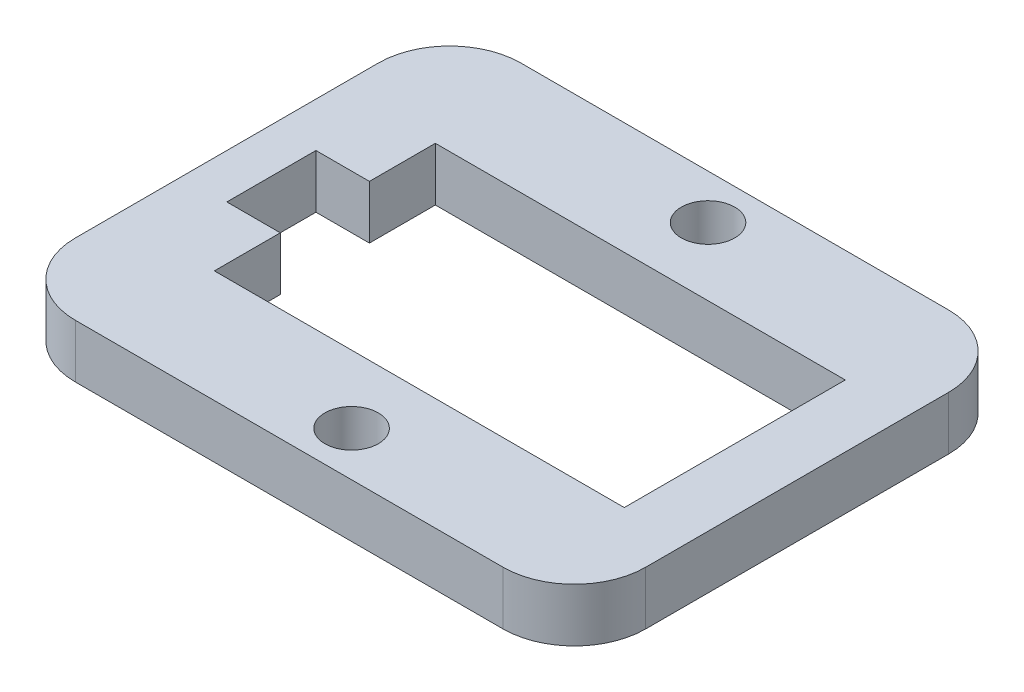
ISO-10303-21;
HEADER;
FILE_DESCRIPTION(('STEP AP214'),'2;1');
FILE_NAME('part.step','',(''),(''),'','','');
FILE_SCHEMA(('AUTOMOTIVE_DESIGN { 1 0 10303 214 1 1 1 1 }'));
ENDSEC;
DATA;
#1=APPLICATION_CONTEXT('core data for automotive mechanical design processes');
#2=APPLICATION_PROTOCOL_DEFINITION('international standard','automotive_design',2000,#1);
#3=PRODUCT_CONTEXT('',#1,'mechanical');
#4=PRODUCT('Part','Part','',(#3));
#5=PRODUCT_RELATED_PRODUCT_CATEGORY('part','',(#4));
#6=PRODUCT_DEFINITION_FORMATION('','',#4);
#7=PRODUCT_DEFINITION_CONTEXT('part definition',#1,'design');
#8=PRODUCT_DEFINITION('design','',#6,#7);
#9=PRODUCT_DEFINITION_SHAPE('','',#8);
#10=(LENGTH_UNIT() NAMED_UNIT(*) SI_UNIT(.MILLI.,.METRE.));
#11=(NAMED_UNIT(*) PLANE_ANGLE_UNIT() SI_UNIT($,.RADIAN.));
#12=(NAMED_UNIT(*) SI_UNIT($,.STERADIAN.) SOLID_ANGLE_UNIT());
#13=UNCERTAINTY_MEASURE_WITH_UNIT(LENGTH_MEASURE(1.E-05),#10,'distance_accuracy_value','');
#14=(GEOMETRIC_REPRESENTATION_CONTEXT(3) GLOBAL_UNCERTAINTY_ASSIGNED_CONTEXT((#13)) GLOBAL_UNIT_ASSIGNED_CONTEXT((#10,
#11,#12)) REPRESENTATION_CONTEXT('',''));
#15=CARTESIAN_POINT('',(0.,0.,0.));
#16=DIRECTION('',(0.,0.,1.));
#17=DIRECTION('',(1.,0.,0.));
#18=AXIS2_PLACEMENT_3D('',#15,#16,#17);
#19=CARTESIAN_POINT('',(-10.5,0.,6.20000000000001));
#20=DIRECTION('',(-1.,0.,0.));
#21=DIRECTION('',(0.,0.,1.));
#22=AXIS2_PLACEMENT_3D('',#19,#20,#21);
#23=PLANE('',#22);
#24=DIRECTION('',(0.,0.,1.));
#25=VECTOR('',#24,1.);
#26=CARTESIAN_POINT('',(-10.5,0.,6.20000000000001));
#27=LINE('',#26,#25);
#28=CARTESIAN_POINT('',(-10.5,0.,2.50000000000001));
#29=VERTEX_POINT('',#28);
#30=CARTESIAN_POINT('',(-10.5,0.,6.20000000000001));
#31=VERTEX_POINT('',#30);
#32=EDGE_CURVE('E208',#29,#31,#27,.T.);
#33=ORIENTED_EDGE('',*,*,#32,.F.);
#34=DIRECTION('',(0.,1.,0.));
#35=VECTOR('',#34,1.);
#36=CARTESIAN_POINT('',(-10.5,0.,2.50000000000001));
#37=LINE('',#36,#35);
#38=CARTESIAN_POINT('',(-10.5,3.,2.50000000000001));
#39=VERTEX_POINT('',#38);
#40=EDGE_CURVE('E184',#29,#39,#37,.T.);
#41=ORIENTED_EDGE('',*,*,#40,.T.);
#42=DIRECTION('',(0.,0.,1.));
#43=VECTOR('',#42,1.);
#44=CARTESIAN_POINT('',(-10.5,3.,6.20000000000001));
#45=LINE('',#44,#43);
#46=CARTESIAN_POINT('',(-10.5,3.,6.20000000000001));
#47=VERTEX_POINT('',#46);
#48=EDGE_CURVE('E218',#39,#47,#45,.T.);
#49=ORIENTED_EDGE('',*,*,#48,.T.);
#50=DIRECTION('',(0.,1.,0.));
#51=VECTOR('',#50,1.);
#52=CARTESIAN_POINT('',(-10.5,0.,6.20000000000001));
#53=LINE('',#52,#51);
#54=EDGE_CURVE('E227',#31,#47,#53,.T.);
#55=ORIENTED_EDGE('',*,*,#54,.F.);
#56=EDGE_LOOP('',(#33,#41,#49,#55));
#57=FACE_BOUND('',#56,.T.);
#58=ADVANCED_FACE('F36',(#57),#23,.F.);
#59=CARTESIAN_POINT('',(0.,0.,0.));
#60=DIRECTION('',(0.,-1.,0.));
#61=DIRECTION('',(0.,0.,-1.));
#62=AXIS2_PLACEMENT_3D('',#59,#60,#61);
#63=PLANE('',#62);
#64=DIRECTION('',(1.,0.,0.));
#65=VECTOR('',#64,1.);
#66=CARTESIAN_POINT('',(-13.5,0.,2.50000000000001));
#67=LINE('',#66,#65);
#68=CARTESIAN_POINT('',(-13.5,0.,2.50000000000001));
#69=VERTEX_POINT('',#68);
#70=EDGE_CURVE('E169',#69,#29,#67,.T.);
#71=ORIENTED_EDGE('',*,*,#70,.T.);
#72=ORIENTED_EDGE('',*,*,#32,.T.);
#73=DIRECTION('',(1.,0.,0.));
#74=VECTOR('',#73,1.);
#75=CARTESIAN_POINT('',(-10.5,0.,6.20000000000001));
#76=LINE('',#75,#74);
#77=CARTESIAN_POINT('',(12.5,0.,6.2));
#78=VERTEX_POINT('',#77);
#79=EDGE_CURVE('E210',#31,#78,#76,.T.);
#80=ORIENTED_EDGE('',*,*,#79,.T.);
#81=DIRECTION('',(0.,0.,-1.));
#82=VECTOR('',#81,1.);
#83=CARTESIAN_POINT('',(12.5,0.,6.2));
#84=LINE('',#83,#82);
#85=CARTESIAN_POINT('',(12.5,0.,-6.2));
#86=VERTEX_POINT('',#85);
#87=EDGE_CURVE('E202',#78,#86,#84,.T.);
#88=ORIENTED_EDGE('',*,*,#87,.T.);
#89=DIRECTION('',(-1.,0.,0.));
#90=VECTOR('',#89,1.);
#91=CARTESIAN_POINT('',(-10.5,0.,-6.19999999999998));
#92=LINE('',#91,#90);
#93=CARTESIAN_POINT('',(-10.5,0.,-6.19999999999998));
#94=VERTEX_POINT('',#93);
#95=EDGE_CURVE('E205',#86,#94,#92,.T.);
#96=ORIENTED_EDGE('',*,*,#95,.T.);
#97=CARTESIAN_POINT('',(-10.5,0.,-2.5));
#98=VERTEX_POINT('',#97);
#99=EDGE_CURVE('E175',#94,#98,#27,.T.);
#100=ORIENTED_EDGE('',*,*,#99,.T.);
#101=DIRECTION('',(-1.,0.,0.));
#102=VECTOR('',#101,1.);
#103=CARTESIAN_POINT('',(-13.5,0.,-2.5));
#104=LINE('',#103,#102);
#105=CARTESIAN_POINT('',(-13.5,0.,-2.5));
#106=VERTEX_POINT('',#105);
#107=EDGE_CURVE('E153',#98,#106,#104,.T.);
#108=ORIENTED_EDGE('',*,*,#107,.T.);
#109=DIRECTION('',(0.,0.,1.));
#110=VECTOR('',#109,1.);
#111=CARTESIAN_POINT('',(-13.5,0.,-2.5));
#112=LINE('',#111,#110);
#113=EDGE_CURVE('E164',#106,#69,#112,.T.);
#114=ORIENTED_EDGE('',*,*,#113,.T.);
#115=EDGE_LOOP('',(#71,#72,#80,#88,#96,#100,#108,#114));
#116=FACE_BOUND('',#115,.T.);
#117=CARTESIAN_POINT('',(1.00000000000001,0.,-10.));
#118=DIRECTION('',(0.,1.,0.));
#119=DIRECTION('',(0.,0.,1.));
#120=AXIS2_PLACEMENT_3D('',#117,#118,#119);
#121=CIRCLE('',#120,1.5);
#122=CARTESIAN_POINT('',(1.00000000000001,0.,-8.5));
#123=VERTEX_POINT('',#122);
#124=EDGE_CURVE('E192',#123,#123,#121,.T.);
#125=ORIENTED_EDGE('',*,*,#124,.T.);
#126=EDGE_LOOP('',(#125));
#127=FACE_BOUND('',#126,.T.);
#128=DIRECTION('',(1.,0.,0.));
#129=VECTOR('',#128,1.);
#130=CARTESIAN_POINT('',(-16.,0.,12.5));
#131=LINE('',#130,#129);
#132=CARTESIAN_POINT('',(-12.,0.,12.5));
#133=VERTEX_POINT('',#132);
#134=CARTESIAN_POINT('',(12.,0.,12.5));
#135=VERTEX_POINT('',#134);
#136=EDGE_CURVE('E237',#133,#135,#131,.T.);
#137=ORIENTED_EDGE('',*,*,#136,.F.);
#138=CARTESIAN_POINT('',(-12.,0.,8.5));
#139=DIRECTION('',(0.,-1.,0.));
#140=DIRECTION('',(0.,0.,-1.));
#141=AXIS2_PLACEMENT_3D('',#138,#139,#140);
#142=CIRCLE('',#141,4.);
#143=CARTESIAN_POINT('',(-16.,0.,8.5));
#144=VERTEX_POINT('',#143);
#145=EDGE_CURVE('E265',#133,#144,#142,.T.);
#146=ORIENTED_EDGE('',*,*,#145,.T.);
#147=DIRECTION('',(0.,0.,1.));
#148=VECTOR('',#147,1.);
#149=CARTESIAN_POINT('',(-16.,0.,12.5));
#150=LINE('',#149,#148);
#151=CARTESIAN_POINT('',(-16.,0.,-8.5));
#152=VERTEX_POINT('',#151);
#153=EDGE_CURVE('E250',#152,#144,#150,.T.);
#154=ORIENTED_EDGE('',*,*,#153,.F.);
#155=CARTESIAN_POINT('',(-12.,0.,-8.5));
#156=DIRECTION('',(0.,-1.,0.));
#157=DIRECTION('',(0.,0.,-1.));
#158=AXIS2_PLACEMENT_3D('',#155,#156,#157);
#159=CIRCLE('',#158,4.);
#160=CARTESIAN_POINT('',(-12.,0.,-12.5));
#161=VERTEX_POINT('',#160);
#162=EDGE_CURVE('E263',#152,#161,#159,.T.);
#163=ORIENTED_EDGE('',*,*,#162,.T.);
#164=DIRECTION('',(-1.,0.,0.));
#165=VECTOR('',#164,1.);
#166=CARTESIAN_POINT('',(-16.,0.,-12.5));
#167=LINE('',#166,#165);
#168=CARTESIAN_POINT('',(12.,0.,-12.5));
#169=VERTEX_POINT('',#168);
#170=EDGE_CURVE('E248',#169,#161,#167,.T.);
#171=ORIENTED_EDGE('',*,*,#170,.F.);
#172=CARTESIAN_POINT('',(12.,0.,-8.5));
#173=DIRECTION('',(0.,-1.,0.));
#174=DIRECTION('',(0.,0.,-1.));
#175=AXIS2_PLACEMENT_3D('',#172,#173,#174);
#176=CIRCLE('',#175,4.);
#177=CARTESIAN_POINT('',(16.,0.,-8.5));
#178=VERTEX_POINT('',#177);
#179=EDGE_CURVE('E261',#169,#178,#176,.T.);
#180=ORIENTED_EDGE('',*,*,#179,.T.);
#181=DIRECTION('',(0.,0.,-1.));
#182=VECTOR('',#181,1.);
#183=CARTESIAN_POINT('',(16.,0.,12.5));
#184=LINE('',#183,#182);
#185=CARTESIAN_POINT('',(16.,0.,8.5));
#186=VERTEX_POINT('',#185);
#187=EDGE_CURVE('E226',#186,#178,#184,.T.);
#188=ORIENTED_EDGE('',*,*,#187,.F.);
#189=CARTESIAN_POINT('',(12.,0.,8.5));
#190=DIRECTION('',(0.,-1.,0.));
#191=DIRECTION('',(0.,0.,-1.));
#192=AXIS2_PLACEMENT_3D('',#189,#190,#191);
#193=CIRCLE('',#192,4.);
#194=EDGE_CURVE('E259',#186,#135,#193,.T.);
#195=ORIENTED_EDGE('',*,*,#194,.T.);
#196=EDGE_LOOP('',(#137,#146,#154,#163,#171,#180,#188,#195));
#197=FACE_BOUND('',#196,.T.);
#198=CARTESIAN_POINT('',(1.00000000000001,0.,10.));
#199=DIRECTION('',(0.,1.,0.));
#200=DIRECTION('',(0.,0.,1.));
#201=AXIS2_PLACEMENT_3D('',#198,#199,#200);
#202=CIRCLE('',#201,1.5);
#203=CARTESIAN_POINT('',(1.00000000000001,0.,11.5));
#204=VERTEX_POINT('',#203);
#205=EDGE_CURVE('E198',#204,#204,#202,.T.);
#206=ORIENTED_EDGE('',*,*,#205,.T.);
#207=EDGE_LOOP('',(#206));
#208=FACE_BOUND('',#207,.T.);
#209=ADVANCED_FACE('F172',(#116,#127,#197,#208),#63,.T.);
#210=CARTESIAN_POINT('',(16.,3.,12.5));
#211=DIRECTION('',(-1.,0.,0.));
#212=DIRECTION('',(0.,0.,1.));
#213=AXIS2_PLACEMENT_3D('',#210,#211,#212);
#214=PLANE('',#213);
#215=ORIENTED_EDGE('',*,*,#187,.T.);
#216=DIRECTION('',(0.,-1.,0.));
#217=VECTOR('',#216,1.);
#218=CARTESIAN_POINT('',(16.,3.,-8.5));
#219=LINE('',#218,#217);
#220=CARTESIAN_POINT('',(16.,3.,-8.5));
#221=VERTEX_POINT('',#220);
#222=EDGE_CURVE('E11',#178,#221,#219,.F.);
#223=ORIENTED_EDGE('',*,*,#222,.T.);
#224=DIRECTION('',(0.,0.,-1.));
#225=VECTOR('',#224,1.);
#226=CARTESIAN_POINT('',(16.,3.,12.5));
#227=LINE('',#226,#225);
#228=CARTESIAN_POINT('',(16.,3.,8.5));
#229=VERTEX_POINT('',#228);
#230=EDGE_CURVE('E234',#229,#221,#227,.T.);
#231=ORIENTED_EDGE('',*,*,#230,.F.);
#232=DIRECTION('',(0.,-1.,0.));
#233=VECTOR('',#232,1.);
#234=CARTESIAN_POINT('',(16.,3.,8.5));
#235=LINE('',#234,#233);
#236=EDGE_CURVE('E44',#229,#186,#235,.T.);
#237=ORIENTED_EDGE('',*,*,#236,.T.);
#238=EDGE_LOOP('',(#215,#223,#231,#237));
#239=FACE_BOUND('',#238,.T.);
#240=ADVANCED_FACE('F287',(#239),#214,.F.);
#241=CARTESIAN_POINT('',(-16.,3.,-12.5));
#242=DIRECTION('',(0.,0.,1.));
#243=DIRECTION('',(1.,0.,0.));
#244=AXIS2_PLACEMENT_3D('',#241,#242,#243);
#245=PLANE('',#244);
#246=ORIENTED_EDGE('',*,*,#170,.T.);
#247=DIRECTION('',(0.,-1.,0.));
#248=VECTOR('',#247,1.);
#249=CARTESIAN_POINT('',(-12.,3.,-12.5));
#250=LINE('',#249,#248);
#251=CARTESIAN_POINT('',(-12.,3.,-12.5));
#252=VERTEX_POINT('',#251);
#253=EDGE_CURVE('E51',#161,#252,#250,.F.);
#254=ORIENTED_EDGE('',*,*,#253,.T.);
#255=DIRECTION('',(-1.,0.,0.));
#256=VECTOR('',#255,1.);
#257=CARTESIAN_POINT('',(-16.,3.,-12.5));
#258=LINE('',#257,#256);
#259=CARTESIAN_POINT('',(12.,3.,-12.5));
#260=VERTEX_POINT('',#259);
#261=EDGE_CURVE('E236',#260,#252,#258,.T.);
#262=ORIENTED_EDGE('',*,*,#261,.F.);
#263=DIRECTION('',(0.,-1.,0.));
#264=VECTOR('',#263,1.);
#265=CARTESIAN_POINT('',(12.,3.,-12.5));
#266=LINE('',#265,#264);
#267=EDGE_CURVE('E279',#260,#169,#266,.T.);
#268=ORIENTED_EDGE('',*,*,#267,.T.);
#269=EDGE_LOOP('',(#246,#254,#262,#268));
#270=FACE_BOUND('',#269,.T.);
#271=ADVANCED_FACE('F298',(#270),#245,.F.);
#272=CARTESIAN_POINT('',(-16.,3.,12.5));
#273=DIRECTION('',(1.,0.,0.));
#274=DIRECTION('',(0.,0.,-1.));
#275=AXIS2_PLACEMENT_3D('',#272,#273,#274);
#276=PLANE('',#275);
#277=ORIENTED_EDGE('',*,*,#153,.T.);
#278=DIRECTION('',(0.,-1.,0.));
#279=VECTOR('',#278,1.);
#280=CARTESIAN_POINT('',(-16.,3.,8.5));
#281=LINE('',#280,#279);
#282=CARTESIAN_POINT('',(-16.,3.,8.5));
#283=VERTEX_POINT('',#282);
#284=EDGE_CURVE('E270',#144,#283,#281,.F.);
#285=ORIENTED_EDGE('',*,*,#284,.T.);
#286=DIRECTION('',(0.,0.,1.));
#287=VECTOR('',#286,1.);
#288=CARTESIAN_POINT('',(-16.,3.,12.5));
#289=LINE('',#288,#287);
#290=CARTESIAN_POINT('',(-16.,3.,-8.5));
#291=VERTEX_POINT('',#290);
#292=EDGE_CURVE('E239',#291,#283,#289,.T.);
#293=ORIENTED_EDGE('',*,*,#292,.F.);
#294=DIRECTION('',(0.,-1.,0.));
#295=VECTOR('',#294,1.);
#296=CARTESIAN_POINT('',(-16.,3.,-8.5));
#297=LINE('',#296,#295);
#298=EDGE_CURVE('E267',#291,#152,#297,.T.);
#299=ORIENTED_EDGE('',*,*,#298,.T.);
#300=EDGE_LOOP('',(#277,#285,#293,#299));
#301=FACE_BOUND('',#300,.T.);
#302=ADVANCED_FACE('F307',(#301),#276,.F.);
#303=CARTESIAN_POINT('',(-16.,3.,12.5));
#304=DIRECTION('',(0.,0.,-1.));
#305=DIRECTION('',(-1.,0.,0.));
#306=AXIS2_PLACEMENT_3D('',#303,#304,#305);
#307=PLANE('',#306);
#308=DIRECTION('',(1.,0.,0.));
#309=VECTOR('',#308,1.);
#310=CARTESIAN_POINT('',(-16.,3.,12.5));
#311=LINE('',#310,#309);
#312=CARTESIAN_POINT('',(-12.,3.,12.5));
#313=VERTEX_POINT('',#312);
#314=CARTESIAN_POINT('',(12.,3.,12.5));
#315=VERTEX_POINT('',#314);
#316=EDGE_CURVE('E242',#313,#315,#311,.T.);
#317=ORIENTED_EDGE('',*,*,#316,.F.);
#318=DIRECTION('',(0.,-1.,0.));
#319=VECTOR('',#318,1.);
#320=CARTESIAN_POINT('',(-12.,3.,12.5));
#321=LINE('',#320,#319);
#322=EDGE_CURVE('E256',#313,#133,#321,.T.);
#323=ORIENTED_EDGE('',*,*,#322,.T.);
#324=ORIENTED_EDGE('',*,*,#136,.T.);
#325=DIRECTION('',(0.,-1.,0.));
#326=VECTOR('',#325,1.);
#327=CARTESIAN_POINT('',(12.,3.,12.5));
#328=LINE('',#327,#326);
#329=EDGE_CURVE('E245',#135,#315,#328,.F.);
#330=ORIENTED_EDGE('',*,*,#329,.T.);
#331=EDGE_LOOP('',(#317,#323,#324,#330));
#332=FACE_BOUND('',#331,.T.);
#333=ADVANCED_FACE('F315',(#332),#307,.F.);
#334=CARTESIAN_POINT('',(0.,3.,0.));
#335=DIRECTION('',(0.,-1.,0.));
#336=DIRECTION('',(0.,0.,-1.));
#337=AXIS2_PLACEMENT_3D('',#334,#335,#336);
#338=PLANE('',#337);
#339=CARTESIAN_POINT('',(1.00000000000001,3.,-10.));
#340=DIRECTION('',(0.,1.,0.));
#341=DIRECTION('',(0.,0.,1.));
#342=AXIS2_PLACEMENT_3D('',#339,#340,#341);
#343=CIRCLE('',#342,1.5);
#344=CARTESIAN_POINT('',(1.00000000000001,3.,-8.5));
#345=VERTEX_POINT('',#344);
#346=EDGE_CURVE('E187',#345,#345,#343,.T.);
#347=ORIENTED_EDGE('',*,*,#346,.F.);
#348=EDGE_LOOP('',(#347));
#349=FACE_BOUND('',#348,.T.);
#350=CARTESIAN_POINT('',(1.00000000000001,3.,10.));
#351=DIRECTION('',(0.,1.,0.));
#352=DIRECTION('',(0.,0.,1.));
#353=AXIS2_PLACEMENT_3D('',#350,#351,#352);
#354=CIRCLE('',#353,1.5);
#355=CARTESIAN_POINT('',(1.00000000000001,3.,11.5));
#356=VERTEX_POINT('',#355);
#357=EDGE_CURVE('E195',#356,#356,#354,.T.);
#358=ORIENTED_EDGE('',*,*,#357,.F.);
#359=EDGE_LOOP('',(#358));
#360=FACE_BOUND('',#359,.T.);
#361=ORIENTED_EDGE('',*,*,#48,.F.);
#362=DIRECTION('',(1.,0.,0.));
#363=VECTOR('',#362,1.);
#364=CARTESIAN_POINT('',(-13.5,3.,2.50000000000001));
#365=LINE('',#364,#363);
#366=CARTESIAN_POINT('',(-13.5,3.,2.50000000000001));
#367=VERTEX_POINT('',#366);
#368=EDGE_CURVE('E176',#367,#39,#365,.T.);
#369=ORIENTED_EDGE('',*,*,#368,.F.);
#370=DIRECTION('',(0.,0.,1.));
#371=VECTOR('',#370,1.);
#372=CARTESIAN_POINT('',(-13.5,3.,-2.5));
#373=LINE('',#372,#371);
#374=CARTESIAN_POINT('',(-13.5,3.,-2.5));
#375=VERTEX_POINT('',#374);
#376=EDGE_CURVE('E178',#375,#367,#373,.T.);
#377=ORIENTED_EDGE('',*,*,#376,.F.);
#378=DIRECTION('',(-1.,0.,0.));
#379=VECTOR('',#378,1.);
#380=CARTESIAN_POINT('',(-13.5,3.,-2.5));
#381=LINE('',#380,#379);
#382=CARTESIAN_POINT('',(-10.5,3.,-2.5));
#383=VERTEX_POINT('',#382);
#384=EDGE_CURVE('E156',#383,#375,#381,.T.);
#385=ORIENTED_EDGE('',*,*,#384,.F.);
#386=CARTESIAN_POINT('',(-10.5,3.,-6.19999999999998));
#387=VERTEX_POINT('',#386);
#388=EDGE_CURVE('E219',#387,#383,#45,.T.);
#389=ORIENTED_EDGE('',*,*,#388,.F.);
#390=DIRECTION('',(-1.,0.,0.));
#391=VECTOR('',#390,1.);
#392=CARTESIAN_POINT('',(-10.5,3.,-6.19999999999998));
#393=LINE('',#392,#391);
#394=CARTESIAN_POINT('',(12.5,3.,-6.2));
#395=VERTEX_POINT('',#394);
#396=EDGE_CURVE('E215',#395,#387,#393,.T.);
#397=ORIENTED_EDGE('',*,*,#396,.F.);
#398=DIRECTION('',(0.,0.,-1.));
#399=VECTOR('',#398,1.);
#400=CARTESIAN_POINT('',(12.5,3.,6.2));
#401=LINE('',#400,#399);
#402=CARTESIAN_POINT('',(12.5,3.,6.2));
#403=VERTEX_POINT('',#402);
#404=EDGE_CURVE('E201',#403,#395,#401,.T.);
#405=ORIENTED_EDGE('',*,*,#404,.F.);
#406=DIRECTION('',(1.,0.,0.));
#407=VECTOR('',#406,1.);
#408=CARTESIAN_POINT('',(-10.5,3.,6.20000000000001));
#409=LINE('',#408,#407);
#410=EDGE_CURVE('E206',#47,#403,#409,.T.);
#411=ORIENTED_EDGE('',*,*,#410,.F.);
#412=EDGE_LOOP('',(#361,#369,#377,#385,#389,#397,#405,#411));
#413=FACE_BOUND('',#412,.T.);
#414=ORIENTED_EDGE('',*,*,#292,.T.);
#415=CARTESIAN_POINT('',(-12.,3.,8.5));
#416=DIRECTION('',(0.,-1.,0.));
#417=DIRECTION('',(0.,0.,-1.));
#418=AXIS2_PLACEMENT_3D('',#415,#416,#417);
#419=CIRCLE('',#418,4.);
#420=EDGE_CURVE('E277',#283,#313,#419,.F.);
#421=ORIENTED_EDGE('',*,*,#420,.T.);
#422=ORIENTED_EDGE('',*,*,#316,.T.);
#423=CARTESIAN_POINT('',(12.,3.,8.5));
#424=DIRECTION('',(0.,-1.,0.));
#425=DIRECTION('',(0.,0.,-1.));
#426=AXIS2_PLACEMENT_3D('',#423,#424,#425);
#427=CIRCLE('',#426,4.);
#428=EDGE_CURVE('E272',#315,#229,#427,.F.);
#429=ORIENTED_EDGE('',*,*,#428,.T.);
#430=ORIENTED_EDGE('',*,*,#230,.T.);
#431=CARTESIAN_POINT('',(12.,3.,-8.5));
#432=DIRECTION('',(0.,-1.,0.));
#433=DIRECTION('',(0.,0.,-1.));
#434=AXIS2_PLACEMENT_3D('',#431,#432,#433);
#435=CIRCLE('',#434,4.);
#436=EDGE_CURVE('E58',#221,#260,#435,.F.);
#437=ORIENTED_EDGE('',*,*,#436,.T.);
#438=ORIENTED_EDGE('',*,*,#261,.T.);
#439=CARTESIAN_POINT('',(-12.,3.,-8.5));
#440=DIRECTION('',(0.,-1.,0.));
#441=DIRECTION('',(0.,0.,-1.));
#442=AXIS2_PLACEMENT_3D('',#439,#440,#441);
#443=CIRCLE('',#442,4.);
#444=EDGE_CURVE('E275',#252,#291,#443,.F.);
#445=ORIENTED_EDGE('',*,*,#444,.T.);
#446=EDGE_LOOP('',(#414,#421,#422,#429,#430,#437,#438,#445));
#447=FACE_BOUND('',#446,.T.);
#448=ADVANCED_FACE('F300',(#349,#360,#413,#447),#338,.F.);
#449=CARTESIAN_POINT('',(12.5,0.,6.2));
#450=DIRECTION('',(1.,0.,0.));
#451=DIRECTION('',(0.,0.,-1.));
#452=AXIS2_PLACEMENT_3D('',#449,#450,#451);
#453=PLANE('',#452);
#454=ORIENTED_EDGE('',*,*,#404,.T.);
#455=DIRECTION('',(0.,1.,0.));
#456=VECTOR('',#455,1.);
#457=CARTESIAN_POINT('',(12.5,0.,-6.2));
#458=LINE('',#457,#456);
#459=EDGE_CURVE('E213',#86,#395,#458,.T.);
#460=ORIENTED_EDGE('',*,*,#459,.F.);
#461=ORIENTED_EDGE('',*,*,#87,.F.);
#462=DIRECTION('',(0.,1.,0.));
#463=VECTOR('',#462,1.);
#464=CARTESIAN_POINT('',(12.5,0.,6.2));
#465=LINE('',#464,#463);
#466=EDGE_CURVE('E224',#78,#403,#465,.T.);
#467=ORIENTED_EDGE('',*,*,#466,.T.);
#468=EDGE_LOOP('',(#454,#460,#461,#467));
#469=FACE_BOUND('',#468,.T.);
#470=ADVANCED_FACE('F342',(#469),#453,.F.);
#471=CARTESIAN_POINT('',(-10.5,0.,6.20000000000001));
#472=DIRECTION('',(0.,0.,1.));
#473=DIRECTION('',(1.,0.,0.));
#474=AXIS2_PLACEMENT_3D('',#471,#472,#473);
#475=PLANE('',#474);
#476=ORIENTED_EDGE('',*,*,#410,.T.);
#477=ORIENTED_EDGE('',*,*,#466,.F.);
#478=ORIENTED_EDGE('',*,*,#79,.F.);
#479=ORIENTED_EDGE('',*,*,#54,.T.);
#480=EDGE_LOOP('',(#476,#477,#478,#479));
#481=FACE_BOUND('',#480,.T.);
#482=ADVANCED_FACE('F334',(#481),#475,.F.);
#483=ORIENTED_EDGE('',*,*,#388,.T.);
#484=DIRECTION('',(0.,1.,0.));
#485=VECTOR('',#484,1.);
#486=CARTESIAN_POINT('',(-10.5,0.,-2.5));
#487=LINE('',#486,#485);
#488=EDGE_CURVE('E161',#98,#383,#487,.T.);
#489=ORIENTED_EDGE('',*,*,#488,.F.);
#490=ORIENTED_EDGE('',*,*,#99,.F.);
#491=DIRECTION('',(0.,1.,0.));
#492=VECTOR('',#491,1.);
#493=CARTESIAN_POINT('',(-10.5,0.,-6.19999999999998));
#494=LINE('',#493,#492);
#495=EDGE_CURVE('E230',#94,#387,#494,.T.);
#496=ORIENTED_EDGE('',*,*,#495,.T.);
#497=EDGE_LOOP('',(#483,#489,#490,#496));
#498=FACE_BOUND('',#497,.T.);
#499=ADVANCED_FACE('F324',(#498),#23,.F.);
#500=CARTESIAN_POINT('',(-10.5,0.,-6.19999999999998));
#501=DIRECTION('',(0.,0.,-1.));
#502=DIRECTION('',(-1.,0.,0.));
#503=AXIS2_PLACEMENT_3D('',#500,#501,#502);
#504=PLANE('',#503);
#505=ORIENTED_EDGE('',*,*,#396,.T.);
#506=ORIENTED_EDGE('',*,*,#495,.F.);
#507=ORIENTED_EDGE('',*,*,#95,.F.);
#508=ORIENTED_EDGE('',*,*,#459,.T.);
#509=EDGE_LOOP('',(#505,#506,#507,#508));
#510=FACE_BOUND('',#509,.T.);
#511=ADVANCED_FACE('F333',(#510),#504,.F.);
#512=CARTESIAN_POINT('',(1.00000000000001,3.,10.));
#513=DIRECTION('',(0.,1.,0.));
#514=DIRECTION('',(0.,0.,1.));
#515=AXIS2_PLACEMENT_3D('',#512,#513,#514);
#516=CYLINDRICAL_SURFACE('',#515,1.5);
#517=ORIENTED_EDGE('',*,*,#205,.F.);
#518=EDGE_LOOP('',(#517));
#519=FACE_BOUND('',#518,.T.);
#520=ORIENTED_EDGE('',*,*,#357,.T.);
#521=EDGE_LOOP('',(#520));
#522=FACE_BOUND('',#521,.T.);
#523=ADVANCED_FACE('F340',(#519,#522),#516,.F.);
#524=CARTESIAN_POINT('',(1.00000000000001,3.,-10.));
#525=DIRECTION('',(0.,1.,0.));
#526=DIRECTION('',(0.,0.,1.));
#527=AXIS2_PLACEMENT_3D('',#524,#525,#526);
#528=CYLINDRICAL_SURFACE('',#527,1.5);
#529=ORIENTED_EDGE('',*,*,#124,.F.);
#530=EDGE_LOOP('',(#529));
#531=FACE_BOUND('',#530,.T.);
#532=ORIENTED_EDGE('',*,*,#346,.T.);
#533=EDGE_LOOP('',(#532));
#534=FACE_BOUND('',#533,.T.);
#535=ADVANCED_FACE('F424',(#531,#534),#528,.F.);
#536=CARTESIAN_POINT('',(-13.5,0.,2.50000000000001));
#537=DIRECTION('',(0.,0.,1.));
#538=DIRECTION('',(1.,0.,0.));
#539=AXIS2_PLACEMENT_3D('',#536,#537,#538);
#540=PLANE('',#539);
#541=ORIENTED_EDGE('',*,*,#368,.T.);
#542=ORIENTED_EDGE('',*,*,#40,.F.);
#543=ORIENTED_EDGE('',*,*,#70,.F.);
#544=DIRECTION('',(0.,1.,0.));
#545=VECTOR('',#544,1.);
#546=CARTESIAN_POINT('',(-13.5,0.,2.50000000000001));
#547=LINE('',#546,#545);
#548=EDGE_CURVE('E160',#69,#367,#547,.T.);
#549=ORIENTED_EDGE('',*,*,#548,.T.);
#550=EDGE_LOOP('',(#541,#542,#543,#549));
#551=FACE_BOUND('',#550,.T.);
#552=ADVANCED_FACE('F353',(#551),#540,.F.);
#553=CARTESIAN_POINT('',(-13.5,0.,-2.5));
#554=DIRECTION('',(-1.,0.,0.));
#555=DIRECTION('',(0.,0.,1.));
#556=AXIS2_PLACEMENT_3D('',#553,#554,#555);
#557=PLANE('',#556);
#558=ORIENTED_EDGE('',*,*,#376,.T.);
#559=ORIENTED_EDGE('',*,*,#548,.F.);
#560=ORIENTED_EDGE('',*,*,#113,.F.);
#561=DIRECTION('',(0.,1.,0.));
#562=VECTOR('',#561,1.);
#563=CARTESIAN_POINT('',(-13.5,0.,-2.5));
#564=LINE('',#563,#562);
#565=EDGE_CURVE('E149',#106,#375,#564,.T.);
#566=ORIENTED_EDGE('',*,*,#565,.T.);
#567=EDGE_LOOP('',(#558,#559,#560,#566));
#568=FACE_BOUND('',#567,.T.);
#569=ADVANCED_FACE('F165',(#568),#557,.F.);
#570=CARTESIAN_POINT('',(-13.5,0.,-2.5));
#571=DIRECTION('',(0.,0.,-1.));
#572=DIRECTION('',(-1.,0.,0.));
#573=AXIS2_PLACEMENT_3D('',#570,#571,#572);
#574=PLANE('',#573);
#575=ORIENTED_EDGE('',*,*,#384,.T.);
#576=ORIENTED_EDGE('',*,*,#565,.F.);
#577=ORIENTED_EDGE('',*,*,#107,.F.);
#578=ORIENTED_EDGE('',*,*,#488,.T.);
#579=EDGE_LOOP('',(#575,#576,#577,#578));
#580=FACE_BOUND('',#579,.T.);
#581=ADVANCED_FACE('F151',(#580),#574,.F.);
#582=CARTESIAN_POINT('',(-12.,3.,8.5));
#583=DIRECTION('',(0.,-1.,0.));
#584=DIRECTION('',(0.,0.,-1.));
#585=AXIS2_PLACEMENT_3D('',#582,#583,#584);
#586=CYLINDRICAL_SURFACE('',#585,4.);
#587=ORIENTED_EDGE('',*,*,#420,.F.);
#588=ORIENTED_EDGE('',*,*,#284,.F.);
#589=ORIENTED_EDGE('',*,*,#145,.F.);
#590=ORIENTED_EDGE('',*,*,#322,.F.);
#591=EDGE_LOOP('',(#587,#588,#589,#590));
#592=FACE_BOUND('',#591,.T.);
#593=ADVANCED_FACE('F312',(#592),#586,.T.);
#594=CARTESIAN_POINT('',(-12.,3.,-8.5));
#595=DIRECTION('',(0.,-1.,0.));
#596=DIRECTION('',(0.,0.,-1.));
#597=AXIS2_PLACEMENT_3D('',#594,#595,#596);
#598=CYLINDRICAL_SURFACE('',#597,4.);
#599=ORIENTED_EDGE('',*,*,#444,.F.);
#600=ORIENTED_EDGE('',*,*,#253,.F.);
#601=ORIENTED_EDGE('',*,*,#162,.F.);
#602=ORIENTED_EDGE('',*,*,#298,.F.);
#603=EDGE_LOOP('',(#599,#600,#601,#602));
#604=FACE_BOUND('',#603,.T.);
#605=ADVANCED_FACE('F304',(#604),#598,.T.);
#606=CARTESIAN_POINT('',(12.,3.,-8.5));
#607=DIRECTION('',(0.,-1.,0.));
#608=DIRECTION('',(0.,0.,-1.));
#609=AXIS2_PLACEMENT_3D('',#606,#607,#608);
#610=CYLINDRICAL_SURFACE('',#609,4.);
#611=ORIENTED_EDGE('',*,*,#436,.F.);
#612=ORIENTED_EDGE('',*,*,#222,.F.);
#613=ORIENTED_EDGE('',*,*,#179,.F.);
#614=ORIENTED_EDGE('',*,*,#267,.F.);
#615=EDGE_LOOP('',(#611,#612,#613,#614));
#616=FACE_BOUND('',#615,.T.);
#617=ADVANCED_FACE('F297',(#616),#610,.T.);
#618=CARTESIAN_POINT('',(12.,3.,8.5));
#619=DIRECTION('',(0.,-1.,0.));
#620=DIRECTION('',(0.,0.,-1.));
#621=AXIS2_PLACEMENT_3D('',#618,#619,#620);
#622=CYLINDRICAL_SURFACE('',#621,4.);
#623=ORIENTED_EDGE('',*,*,#428,.F.);
#624=ORIENTED_EDGE('',*,*,#329,.F.);
#625=ORIENTED_EDGE('',*,*,#194,.F.);
#626=ORIENTED_EDGE('',*,*,#236,.F.);
#627=EDGE_LOOP('',(#623,#624,#625,#626));
#628=FACE_BOUND('',#627,.T.);
#629=ADVANCED_FACE('F38',(#628),#622,.T.);
#630=CLOSED_SHELL('',(#58,#209,#240,#271,#302,#333,#448,#470,#482,#499,#511,#523,#535,#552,#569,
#581,#593,#605,#617,#629));
#631=MANIFOLD_SOLID_BREP('B2',#630);
#632=ADVANCED_BREP_SHAPE_REPRESENTATION('',(#18,#631),#14);
#633=SHAPE_DEFINITION_REPRESENTATION(#9,#632);
ENDSEC;
END-ISO-10303-21;
